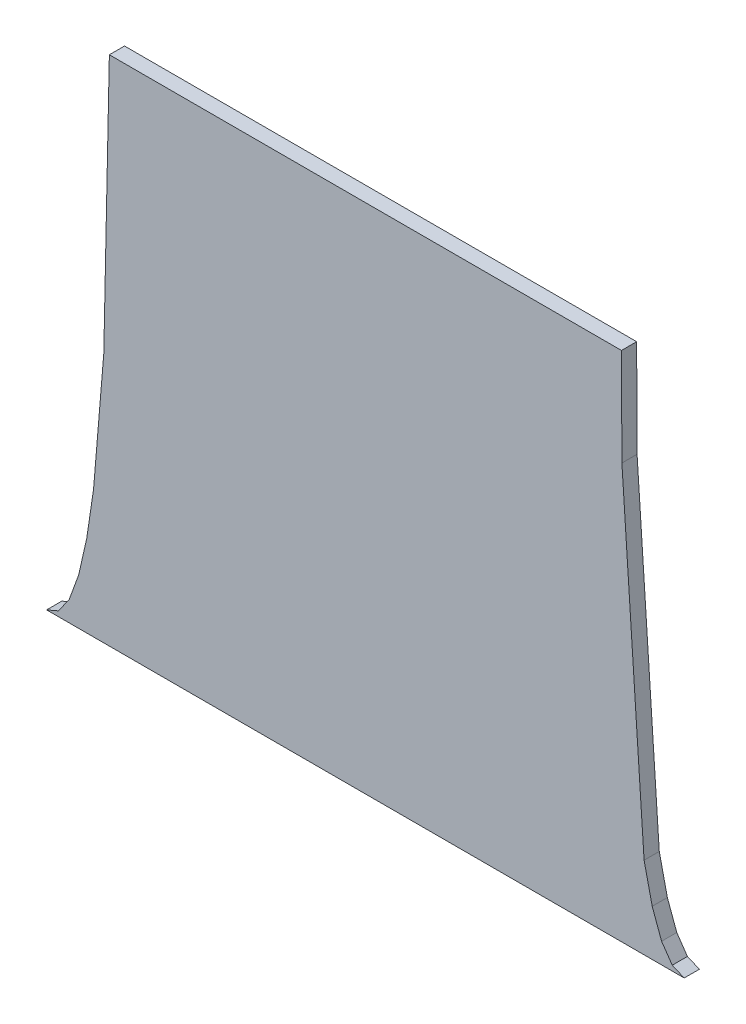
ISO-10303-21;
HEADER;
FILE_DESCRIPTION(('STEP AP214'),'2;1');
FILE_NAME('part.step','',(''),(''),'','','');
FILE_SCHEMA(('AUTOMOTIVE_DESIGN { 1 0 10303 214 1 1 1 1 }'));
ENDSEC;
DATA;
#1=APPLICATION_CONTEXT('core data for automotive mechanical design processes');
#2=APPLICATION_PROTOCOL_DEFINITION('international standard','automotive_design',2000,#1);
#3=PRODUCT_CONTEXT('',#1,'mechanical');
#4=PRODUCT('Part','Part','',(#3));
#5=PRODUCT_RELATED_PRODUCT_CATEGORY('part','',(#4));
#6=PRODUCT_DEFINITION_FORMATION('','',#4);
#7=PRODUCT_DEFINITION_CONTEXT('part definition',#1,'design');
#8=PRODUCT_DEFINITION('design','',#6,#7);
#9=PRODUCT_DEFINITION_SHAPE('','',#8);
#10=(LENGTH_UNIT() NAMED_UNIT(*) SI_UNIT(.MILLI.,.METRE.));
#11=(NAMED_UNIT(*) PLANE_ANGLE_UNIT() SI_UNIT($,.RADIAN.));
#12=(NAMED_UNIT(*) SI_UNIT($,.STERADIAN.) SOLID_ANGLE_UNIT());
#13=UNCERTAINTY_MEASURE_WITH_UNIT(LENGTH_MEASURE(1.E-05),#10,'distance_accuracy_value','');
#14=(GEOMETRIC_REPRESENTATION_CONTEXT(3) GLOBAL_UNCERTAINTY_ASSIGNED_CONTEXT((#13)) GLOBAL_UNIT_ASSIGNED_CONTEXT((#10,
#11,#12)) REPRESENTATION_CONTEXT('',''));
#15=CARTESIAN_POINT('',(0.,0.,0.));
#16=DIRECTION('',(0.,0.,1.));
#17=DIRECTION('',(1.,0.,0.));
#18=AXIS2_PLACEMENT_3D('',#15,#16,#17);
#19=CARTESIAN_POINT('',(105.800003051758,47.9469985961914,0.));
#20=DIRECTION('',(0.999774451350944,-0.0212378536090307,0.));
#21=DIRECTION('',(-0.0212378536090307,-0.999774451350944,0.));
#22=AXIS2_PLACEMENT_3D('',#19,#20,#21);
#23=PLANE('',#22);
#24=DIRECTION('',(-0.0212378536090307,-0.999774451350944,0.));
#25=VECTOR('',#24,1.);
#26=CARTESIAN_POINT('',(105.800003051758,47.9469985961914,0.03556));
#27=LINE('',#26,#25);
#28=CARTESIAN_POINT('',(105.800003051758,47.9469985961914,0.03556));
#29=VERTEX_POINT('',#28);
#30=CARTESIAN_POINT('',(105.787002563477,47.3349990844727,0.03556));
#31=VERTEX_POINT('',#30);
#32=EDGE_CURVE('E11',#29,#31,#27,.T.);
#33=ORIENTED_EDGE('',*,*,#32,.F.);
#34=DIRECTION('',(0.,0.,1.));
#35=VECTOR('',#34,1.);
#36=CARTESIAN_POINT('',(105.800003051758,47.9469985961914,0.));
#37=LINE('',#36,#35);
#38=CARTESIAN_POINT('',(105.800003051758,47.9469985961914,0.));
#39=VERTEX_POINT('',#38);
#40=EDGE_CURVE('E24',#39,#29,#37,.T.);
#41=ORIENTED_EDGE('',*,*,#40,.F.);
#42=DIRECTION('',(-0.0212378536090307,-0.999774451350944,0.));
#43=VECTOR('',#42,1.);
#44=CARTESIAN_POINT('',(105.800003051758,47.9469985961914,0.));
#45=LINE('',#44,#43);
#46=CARTESIAN_POINT('',(105.787002563477,47.3349990844727,0.));
#47=VERTEX_POINT('',#46);
#48=EDGE_CURVE('E142',#39,#47,#45,.T.);
#49=ORIENTED_EDGE('',*,*,#48,.T.);
#50=DIRECTION('',(0.,0.,1.));
#51=VECTOR('',#50,1.);
#52=CARTESIAN_POINT('',(105.787002563477,47.3349990844727,0.));
#53=LINE('',#52,#51);
#54=EDGE_CURVE('E37',#47,#31,#53,.T.);
#55=ORIENTED_EDGE('',*,*,#54,.T.);
#56=EDGE_LOOP('',(#33,#41,#49,#55));
#57=FACE_BOUND('',#56,.T.);
#58=ADVANCED_FACE('F17',(#57),#23,.F.);
#59=CARTESIAN_POINT('',(105.787002563477,47.3349990844727,0.));
#60=DIRECTION('',(0.996545120983932,-0.0830531266306066,0.));
#61=DIRECTION('',(-0.0830531266306066,-0.996545120983932,0.));
#62=AXIS2_PLACEMENT_3D('',#59,#60,#61);
#63=PLANE('',#62);
#64=DIRECTION('',(-0.0830531266306066,-0.996545120983932,0.));
#65=VECTOR('',#64,1.);
#66=CARTESIAN_POINT('',(105.787002563477,47.3349990844727,0.03556));
#67=LINE('',#66,#65);
#68=CARTESIAN_POINT('',(105.763000488281,47.0470008850098,0.03556));
#69=VERTEX_POINT('',#68);
#70=EDGE_CURVE('E238',#31,#69,#67,.T.);
#71=ORIENTED_EDGE('',*,*,#70,.F.);
#72=ORIENTED_EDGE('',*,*,#54,.F.);
#73=DIRECTION('',(-0.0830531266306066,-0.996545120983932,0.));
#74=VECTOR('',#73,1.);
#75=CARTESIAN_POINT('',(105.787002563477,47.3349990844727,0.));
#76=LINE('',#75,#74);
#77=CARTESIAN_POINT('',(105.763000488281,47.0470008850098,0.));
#78=VERTEX_POINT('',#77);
#79=EDGE_CURVE('E235',#47,#78,#76,.T.);
#80=ORIENTED_EDGE('',*,*,#79,.T.);
#81=DIRECTION('',(0.,0.,1.));
#82=VECTOR('',#81,1.);
#83=CARTESIAN_POINT('',(105.763000488281,47.0470008850098,0.));
#84=LINE('',#83,#82);
#85=EDGE_CURVE('E233',#78,#69,#84,.T.);
#86=ORIENTED_EDGE('',*,*,#85,.T.);
#87=EDGE_LOOP('',(#71,#72,#80,#86));
#88=FACE_BOUND('',#87,.T.);
#89=ADVANCED_FACE('F246',(#88),#63,.F.);
#90=CARTESIAN_POINT('',(105.763000488281,47.0470008850098,0.));
#91=DIRECTION('',(0.989205338215747,-0.146535998462731,0.));
#92=DIRECTION('',(-0.146535998462731,-0.989205338215747,0.));
#93=AXIS2_PLACEMENT_3D('',#90,#91,#92);
#94=PLANE('',#93);
#95=DIRECTION('',(-0.146535998462731,-0.989205338215747,0.));
#96=VECTOR('',#95,1.);
#97=CARTESIAN_POINT('',(105.763000488281,47.0470008850098,0.03556));
#98=LINE('',#97,#96);
#99=CARTESIAN_POINT('',(105.747001647949,46.9389991760254,0.03556));
#100=VERTEX_POINT('',#99);
#101=EDGE_CURVE('E230',#69,#100,#98,.T.);
#102=ORIENTED_EDGE('',*,*,#101,.F.);
#103=ORIENTED_EDGE('',*,*,#85,.F.);
#104=DIRECTION('',(-0.146535998462731,-0.989205338215747,0.));
#105=VECTOR('',#104,1.);
#106=CARTESIAN_POINT('',(105.763000488281,47.0470008850098,0.));
#107=LINE('',#106,#105);
#108=CARTESIAN_POINT('',(105.747001647949,46.9389991760254,0.));
#109=VERTEX_POINT('',#108);
#110=EDGE_CURVE('E227',#78,#109,#107,.T.);
#111=ORIENTED_EDGE('',*,*,#110,.T.);
#112=DIRECTION('',(0.,0.,1.));
#113=VECTOR('',#112,1.);
#114=CARTESIAN_POINT('',(105.747001647949,46.9389991760254,0.));
#115=LINE('',#114,#113);
#116=EDGE_CURVE('E225',#109,#100,#115,.T.);
#117=ORIENTED_EDGE('',*,*,#116,.T.);
#118=EDGE_LOOP('',(#102,#103,#111,#117));
#119=FACE_BOUND('',#118,.T.);
#120=ADVANCED_FACE('F252',(#119),#94,.F.);
#121=CARTESIAN_POINT('',(105.747001647949,46.9389991760254,0.));
#122=DIRECTION('',(0.975348205788303,-0.220671424216046,0.));
#123=DIRECTION('',(-0.220671424216046,-0.975348205788303,0.));
#124=AXIS2_PLACEMENT_3D('',#121,#122,#123);
#125=PLANE('',#124);
#126=DIRECTION('',(-0.220671424216046,-0.975348205788303,0.));
#127=VECTOR('',#126,1.);
#128=CARTESIAN_POINT('',(105.747001647949,46.9389991760254,0.03556));
#129=LINE('',#128,#127);
#130=CARTESIAN_POINT('',(105.727996826172,46.8549995422363,0.03556));
#131=VERTEX_POINT('',#130);
#132=EDGE_CURVE('E222',#100,#131,#129,.T.);
#133=ORIENTED_EDGE('',*,*,#132,.F.);
#134=ORIENTED_EDGE('',*,*,#116,.F.);
#135=DIRECTION('',(-0.220671424216046,-0.975348205788303,0.));
#136=VECTOR('',#135,1.);
#137=CARTESIAN_POINT('',(105.747001647949,46.9389991760254,0.));
#138=LINE('',#137,#136);
#139=CARTESIAN_POINT('',(105.727996826172,46.8549995422363,0.));
#140=VERTEX_POINT('',#139);
#141=EDGE_CURVE('E219',#109,#140,#138,.T.);
#142=ORIENTED_EDGE('',*,*,#141,.T.);
#143=DIRECTION('',(0.,0.,1.));
#144=VECTOR('',#143,1.);
#145=CARTESIAN_POINT('',(105.727996826172,46.8549995422363,0.));
#146=LINE('',#145,#144);
#147=EDGE_CURVE('E217',#140,#131,#146,.T.);
#148=ORIENTED_EDGE('',*,*,#147,.T.);
#149=EDGE_LOOP('',(#133,#134,#142,#148));
#150=FACE_BOUND('',#149,.T.);
#151=ADVANCED_FACE('F254',(#150),#125,.F.);
#152=CARTESIAN_POINT('',(105.727996826172,46.8549995422363,0.));
#153=DIRECTION('',(0.93890139471666,-0.3441862446396,0.));
#154=DIRECTION('',(-0.3441862446396,-0.93890139471666,0.));
#155=AXIS2_PLACEMENT_3D('',#152,#153,#154);
#156=PLANE('',#155);
#157=DIRECTION('',(-0.3441862446396,-0.93890139471666,0.));
#158=VECTOR('',#157,1.);
#159=CARTESIAN_POINT('',(105.727996826172,46.8549995422363,0.03556));
#160=LINE('',#159,#158);
#161=CARTESIAN_POINT('',(105.706001281738,46.7949981689453,0.03556));
#162=VERTEX_POINT('',#161);
#163=EDGE_CURVE('E214',#131,#162,#160,.T.);
#164=ORIENTED_EDGE('',*,*,#163,.F.);
#165=ORIENTED_EDGE('',*,*,#147,.F.);
#166=DIRECTION('',(-0.3441862446396,-0.93890139471666,0.));
#167=VECTOR('',#166,1.);
#168=CARTESIAN_POINT('',(105.727996826172,46.8549995422363,0.));
#169=LINE('',#168,#167);
#170=CARTESIAN_POINT('',(105.706001281738,46.7949981689453,0.));
#171=VERTEX_POINT('',#170);
#172=EDGE_CURVE('E211',#140,#171,#169,.T.);
#173=ORIENTED_EDGE('',*,*,#172,.T.);
#174=DIRECTION('',(0.,0.,1.));
#175=VECTOR('',#174,1.);
#176=CARTESIAN_POINT('',(105.706001281738,46.7949981689453,0.));
#177=LINE('',#176,#175);
#178=EDGE_CURVE('E209',#171,#162,#177,.T.);
#179=ORIENTED_EDGE('',*,*,#178,.T.);
#180=EDGE_LOOP('',(#164,#165,#173,#179));
#181=FACE_BOUND('',#180,.T.);
#182=ADVANCED_FACE('F259',(#181),#156,.F.);
#183=CARTESIAN_POINT('',(105.706001281738,46.7949981689453,0.));
#184=DIRECTION('',(0.821348444223406,-0.57042679913534,0.));
#185=DIRECTION('',(-0.57042679913534,-0.821348444223406,0.));
#186=AXIS2_PLACEMENT_3D('',#183,#184,#185);
#187=PLANE('',#186);
#188=DIRECTION('',(-0.57042679913534,-0.821348444223406,0.));
#189=VECTOR('',#188,1.);
#190=CARTESIAN_POINT('',(105.706001281738,46.7949981689453,0.03556));
#191=LINE('',#190,#189);
#192=CARTESIAN_POINT('',(105.680999755859,46.7589988708496,0.03556));
#193=VERTEX_POINT('',#192);
#194=EDGE_CURVE('E206',#162,#193,#191,.T.);
#195=ORIENTED_EDGE('',*,*,#194,.F.);
#196=ORIENTED_EDGE('',*,*,#178,.F.);
#197=DIRECTION('',(-0.57042679913534,-0.821348444223406,0.));
#198=VECTOR('',#197,1.);
#199=CARTESIAN_POINT('',(105.706001281738,46.7949981689453,0.));
#200=LINE('',#199,#198);
#201=CARTESIAN_POINT('',(105.680999755859,46.7589988708496,0.));
#202=VERTEX_POINT('',#201);
#203=EDGE_CURVE('E203',#171,#202,#200,.T.);
#204=ORIENTED_EDGE('',*,*,#203,.T.);
#205=DIRECTION('',(0.,0.,1.));
#206=VECTOR('',#205,1.);
#207=CARTESIAN_POINT('',(105.680999755859,46.7589988708496,0.));
#208=LINE('',#207,#206);
#209=EDGE_CURVE('E201',#202,#193,#208,.T.);
#210=ORIENTED_EDGE('',*,*,#209,.T.);
#211=EDGE_LOOP('',(#195,#196,#204,#210));
#212=FACE_BOUND('',#211,.T.);
#213=ADVANCED_FACE('F262',(#212),#187,.F.);
#214=CARTESIAN_POINT('',(105.680999755859,46.7589988708496,0.));
#215=DIRECTION('',(0.39384372830701,-0.919177413600462,0.));
#216=DIRECTION('',(-0.919177413600462,-0.39384372830701,0.));
#217=AXIS2_PLACEMENT_3D('',#214,#215,#216);
#218=PLANE('',#217);
#219=DIRECTION('',(-0.919177413600462,-0.39384372830701,0.));
#220=VECTOR('',#219,1.);
#221=CARTESIAN_POINT('',(105.680999755859,46.7589988708496,0.03556));
#222=LINE('',#221,#220);
#223=CARTESIAN_POINT('',(105.65299987793,46.7470016479492,0.03556));
#224=VERTEX_POINT('',#223);
#225=EDGE_CURVE('E198',#193,#224,#222,.T.);
#226=ORIENTED_EDGE('',*,*,#225,.F.);
#227=ORIENTED_EDGE('',*,*,#209,.F.);
#228=DIRECTION('',(-0.919177413600462,-0.39384372830701,0.));
#229=VECTOR('',#228,1.);
#230=CARTESIAN_POINT('',(105.680999755859,46.7589988708496,0.));
#231=LINE('',#230,#229);
#232=CARTESIAN_POINT('',(105.65299987793,46.7470016479492,0.));
#233=VERTEX_POINT('',#232);
#234=EDGE_CURVE('E195',#202,#233,#231,.T.);
#235=ORIENTED_EDGE('',*,*,#234,.T.);
#236=DIRECTION('',(0.,0.,1.));
#237=VECTOR('',#236,1.);
#238=CARTESIAN_POINT('',(105.65299987793,46.7470016479492,0.));
#239=LINE('',#238,#237);
#240=EDGE_CURVE('E193',#233,#224,#239,.T.);
#241=ORIENTED_EDGE('',*,*,#240,.T.);
#242=EDGE_LOOP('',(#226,#227,#235,#241));
#243=FACE_BOUND('',#242,.T.);
#244=ADVANCED_FACE('F267',(#243),#218,.F.);
#245=CARTESIAN_POINT('',(105.65299987793,46.7470016479492,0.));
#246=DIRECTION('',(0.,1.,0.));
#247=DIRECTION('',(1.,0.,0.));
#248=AXIS2_PLACEMENT_3D('',#245,#246,#247);
#249=PLANE('',#248);
#250=DIRECTION('',(1.,0.,0.));
#251=VECTOR('',#250,1.);
#252=CARTESIAN_POINT('',(105.65299987793,46.7470016479492,0.03556));
#253=LINE('',#252,#251);
#254=CARTESIAN_POINT('',(107.147003173828,46.7470016479492,0.03556));
#255=VERTEX_POINT('',#254);
#256=EDGE_CURVE('E190',#224,#255,#253,.T.);
#257=ORIENTED_EDGE('',*,*,#256,.F.);
#258=ORIENTED_EDGE('',*,*,#240,.F.);
#259=DIRECTION('',(1.,0.,0.));
#260=VECTOR('',#259,1.);
#261=CARTESIAN_POINT('',(105.65299987793,46.7470016479492,0.));
#262=LINE('',#261,#260);
#263=CARTESIAN_POINT('',(107.147003173828,46.7470016479492,0.));
#264=VERTEX_POINT('',#263);
#265=EDGE_CURVE('E187',#233,#264,#262,.T.);
#266=ORIENTED_EDGE('',*,*,#265,.T.);
#267=DIRECTION('',(0.,0.,1.));
#268=VECTOR('',#267,1.);
#269=CARTESIAN_POINT('',(107.147003173828,46.7470016479492,0.));
#270=LINE('',#269,#268);
#271=EDGE_CURVE('E185',#264,#255,#270,.T.);
#272=ORIENTED_EDGE('',*,*,#271,.T.);
#273=EDGE_LOOP('',(#257,#258,#266,#272));
#274=FACE_BOUND('',#273,.T.);
#275=ADVANCED_FACE('F270',(#274),#249,.F.);
#276=CARTESIAN_POINT('',(107.147003173828,46.7470016479492,0.));
#277=DIRECTION('',(-0.39384372830701,-0.919177413600462,0.));
#278=DIRECTION('',(-0.919177413600462,0.39384372830701,0.));
#279=AXIS2_PLACEMENT_3D('',#276,#277,#278);
#280=PLANE('',#279);
#281=DIRECTION('',(-0.919177413600462,0.39384372830701,0.));
#282=VECTOR('',#281,1.);
#283=CARTESIAN_POINT('',(107.147003173828,46.7470016479492,0.03556));
#284=LINE('',#283,#282);
#285=CARTESIAN_POINT('',(107.119003295898,46.7589988708496,0.03556));
#286=VERTEX_POINT('',#285);
#287=EDGE_CURVE('E182',#255,#286,#284,.T.);
#288=ORIENTED_EDGE('',*,*,#287,.F.);
#289=ORIENTED_EDGE('',*,*,#271,.F.);
#290=DIRECTION('',(-0.919177413600462,0.39384372830701,0.));
#291=VECTOR('',#290,1.);
#292=CARTESIAN_POINT('',(107.147003173828,46.7470016479492,0.));
#293=LINE('',#292,#291);
#294=CARTESIAN_POINT('',(107.119003295898,46.7589988708496,0.));
#295=VERTEX_POINT('',#294);
#296=EDGE_CURVE('E179',#264,#295,#293,.T.);
#297=ORIENTED_EDGE('',*,*,#296,.T.);
#298=DIRECTION('',(0.,0.,1.));
#299=VECTOR('',#298,1.);
#300=CARTESIAN_POINT('',(107.119003295898,46.7589988708496,0.));
#301=LINE('',#300,#299);
#302=EDGE_CURVE('E177',#295,#286,#301,.T.);
#303=ORIENTED_EDGE('',*,*,#302,.T.);
#304=EDGE_LOOP('',(#288,#289,#297,#303));
#305=FACE_BOUND('',#304,.T.);
#306=ADVANCED_FACE('F275',(#305),#280,.F.);
#307=CARTESIAN_POINT('',(107.119003295898,46.7589988708496,0.));
#308=DIRECTION('',(-0.821348444223406,-0.57042679913534,0.));
#309=DIRECTION('',(-0.57042679913534,0.821348444223406,0.));
#310=AXIS2_PLACEMENT_3D('',#307,#308,#309);
#311=PLANE('',#310);
#312=DIRECTION('',(-0.57042679913534,0.821348444223406,0.));
#313=VECTOR('',#312,1.);
#314=CARTESIAN_POINT('',(107.119003295898,46.7589988708496,0.03556));
#315=LINE('',#314,#313);
#316=CARTESIAN_POINT('',(107.09400177002,46.7949981689453,0.03556));
#317=VERTEX_POINT('',#316);
#318=EDGE_CURVE('E174',#286,#317,#315,.T.);
#319=ORIENTED_EDGE('',*,*,#318,.F.);
#320=ORIENTED_EDGE('',*,*,#302,.F.);
#321=DIRECTION('',(-0.57042679913534,0.821348444223406,0.));
#322=VECTOR('',#321,1.);
#323=CARTESIAN_POINT('',(107.119003295898,46.7589988708496,0.));
#324=LINE('',#323,#322);
#325=CARTESIAN_POINT('',(107.09400177002,46.7949981689453,0.));
#326=VERTEX_POINT('',#325);
#327=EDGE_CURVE('E171',#295,#326,#324,.T.);
#328=ORIENTED_EDGE('',*,*,#327,.T.);
#329=DIRECTION('',(0.,0.,1.));
#330=VECTOR('',#329,1.);
#331=CARTESIAN_POINT('',(107.09400177002,46.7949981689453,0.));
#332=LINE('',#331,#330);
#333=EDGE_CURVE('E169',#326,#317,#332,.T.);
#334=ORIENTED_EDGE('',*,*,#333,.T.);
#335=EDGE_LOOP('',(#319,#320,#328,#334));
#336=FACE_BOUND('',#335,.T.);
#337=ADVANCED_FACE('F278',(#336),#311,.F.);
#338=CARTESIAN_POINT('',(107.09400177002,46.7949981689453,0.));
#339=DIRECTION('',(-0.938862810392016,-0.344291480090352,0.));
#340=DIRECTION('',(-0.344291480090352,0.938862810392016,0.));
#341=AXIS2_PLACEMENT_3D('',#338,#339,#340);
#342=PLANE('',#341);
#343=DIRECTION('',(-0.344291480090352,0.938862810392016,0.));
#344=VECTOR('',#343,1.);
#345=CARTESIAN_POINT('',(107.09400177002,46.7949981689453,0.03556));
#346=LINE('',#345,#344);
#347=CARTESIAN_POINT('',(107.071998596191,46.8549995422363,0.03556));
#348=VERTEX_POINT('',#347);
#349=EDGE_CURVE('E166',#317,#348,#346,.T.);
#350=ORIENTED_EDGE('',*,*,#349,.F.);
#351=ORIENTED_EDGE('',*,*,#333,.F.);
#352=DIRECTION('',(-0.344291480090352,0.938862810392016,0.));
#353=VECTOR('',#352,1.);
#354=CARTESIAN_POINT('',(107.09400177002,46.7949981689453,0.));
#355=LINE('',#354,#353);
#356=CARTESIAN_POINT('',(107.071998596191,46.8549995422363,0.));
#357=VERTEX_POINT('',#356);
#358=EDGE_CURVE('E163',#326,#357,#355,.T.);
#359=ORIENTED_EDGE('',*,*,#358,.T.);
#360=DIRECTION('',(0.,0.,1.));
#361=VECTOR('',#360,1.);
#362=CARTESIAN_POINT('',(107.071998596191,46.8549995422363,0.));
#363=LINE('',#362,#361);
#364=EDGE_CURVE('E161',#357,#348,#363,.T.);
#365=ORIENTED_EDGE('',*,*,#364,.T.);
#366=EDGE_LOOP('',(#350,#351,#359,#365));
#367=FACE_BOUND('',#366,.T.);
#368=ADVANCED_FACE('F283',(#367),#342,.F.);
#369=CARTESIAN_POINT('',(107.071998596191,46.8549995422363,0.));
#370=DIRECTION('',(-0.975367269335275,-0.220587148105798,0.));
#371=DIRECTION('',(-0.220587148105798,0.975367269335275,0.));
#372=AXIS2_PLACEMENT_3D('',#369,#370,#371);
#373=PLANE('',#372);
#374=DIRECTION('',(-0.220587148105798,0.975367269335275,0.));
#375=VECTOR('',#374,1.);
#376=CARTESIAN_POINT('',(107.071998596191,46.8549995422363,0.03556));
#377=LINE('',#376,#375);
#378=CARTESIAN_POINT('',(107.053001403809,46.9389991760254,0.03556));
#379=VERTEX_POINT('',#378);
#380=EDGE_CURVE('E158',#348,#379,#377,.T.);
#381=ORIENTED_EDGE('',*,*,#380,.F.);
#382=ORIENTED_EDGE('',*,*,#364,.F.);
#383=DIRECTION('',(-0.220587148105798,0.975367269335275,0.));
#384=VECTOR('',#383,1.);
#385=CARTESIAN_POINT('',(107.071998596191,46.8549995422363,0.));
#386=LINE('',#385,#384);
#387=CARTESIAN_POINT('',(107.053001403809,46.9389991760254,0.));
#388=VERTEX_POINT('',#387);
#389=EDGE_CURVE('E155',#357,#388,#386,.T.);
#390=ORIENTED_EDGE('',*,*,#389,.T.);
#391=DIRECTION('',(0.,0.,1.));
#392=VECTOR('',#391,1.);
#393=CARTESIAN_POINT('',(107.053001403809,46.9389991760254,0.));
#394=LINE('',#393,#392);
#395=EDGE_CURVE('E153',#388,#379,#394,.T.);
#396=ORIENTED_EDGE('',*,*,#395,.T.);
#397=EDGE_LOOP('',(#381,#382,#390,#396));
#398=FACE_BOUND('',#397,.T.);
#399=ADVANCED_FACE('F286',(#398),#373,.F.);
#400=CARTESIAN_POINT('',(107.053001403809,46.9389991760254,0.));
#401=DIRECTION('',(-0.99778500671014,-0.0665212776820051,0.));
#402=DIRECTION('',(-0.0665212776820051,0.99778500671014,0.));
#403=AXIS2_PLACEMENT_3D('',#400,#401,#402);
#404=PLANE('',#403);
#405=DIRECTION('',(-0.0665212776820051,0.99778500671014,0.));
#406=VECTOR('',#405,1.);
#407=CARTESIAN_POINT('',(107.053001403809,46.9389991760254,0.03556));
#408=LINE('',#407,#406);
#409=CARTESIAN_POINT('',(107.000999450684,47.7190017700195,0.03556));
#410=VERTEX_POINT('',#409);
#411=EDGE_CURVE('E150',#379,#410,#408,.T.);
#412=ORIENTED_EDGE('',*,*,#411,.F.);
#413=ORIENTED_EDGE('',*,*,#395,.F.);
#414=DIRECTION('',(-0.0665212776820051,0.99778500671014,0.));
#415=VECTOR('',#414,1.);
#416=CARTESIAN_POINT('',(107.053001403809,46.9389991760254,0.));
#417=LINE('',#416,#415);
#418=CARTESIAN_POINT('',(107.000999450684,47.7190017700195,0.));
#419=VERTEX_POINT('',#418);
#420=EDGE_CURVE('E148',#388,#419,#417,.T.);
#421=ORIENTED_EDGE('',*,*,#420,.T.);
#422=DIRECTION('',(0.,0.,1.));
#423=VECTOR('',#422,1.);
#424=CARTESIAN_POINT('',(107.000999450684,47.7190017700195,0.));
#425=LINE('',#424,#423);
#426=EDGE_CURVE('E133',#419,#410,#425,.T.);
#427=ORIENTED_EDGE('',*,*,#426,.T.);
#428=EDGE_LOOP('',(#412,#413,#421,#427));
#429=FACE_BOUND('',#428,.T.);
#430=ADVANCED_FACE('F289',(#429),#404,.F.);
#431=CARTESIAN_POINT('',(107.000999450684,47.7190017700195,0.));
#432=DIRECTION('',(-0.999990392090998,-0.00438357453366085,0.));
#433=DIRECTION('',(-0.00438357453366085,0.999990392090998,0.));
#434=AXIS2_PLACEMENT_3D('',#431,#432,#433);
#435=PLANE('',#434);
#436=DIRECTION('',(-0.00438357453366085,0.999990392090998,0.));
#437=VECTOR('',#436,1.);
#438=CARTESIAN_POINT('',(107.000999450684,47.7190017700195,0.03556));
#439=LINE('',#438,#437);
#440=CARTESIAN_POINT('',(107.,47.9469985961914,0.03556));
#441=VERTEX_POINT('',#440);
#442=EDGE_CURVE('E137',#410,#441,#439,.T.);
#443=ORIENTED_EDGE('',*,*,#442,.F.);
#444=ORIENTED_EDGE('',*,*,#426,.F.);
#445=DIRECTION('',(-0.00438357453366085,0.999990392090998,0.));
#446=VECTOR('',#445,1.);
#447=CARTESIAN_POINT('',(107.000999450684,47.7190017700195,0.));
#448=LINE('',#447,#446);
#449=CARTESIAN_POINT('',(107.,47.9469985961914,0.));
#450=VERTEX_POINT('',#449);
#451=EDGE_CURVE('E129',#419,#450,#448,.T.);
#452=ORIENTED_EDGE('',*,*,#451,.T.);
#453=DIRECTION('',(0.,0.,1.));
#454=VECTOR('',#453,1.);
#455=CARTESIAN_POINT('',(107.,47.9469985961914,0.));
#456=LINE('',#455,#454);
#457=EDGE_CURVE('E119',#450,#441,#456,.T.);
#458=ORIENTED_EDGE('',*,*,#457,.T.);
#459=EDGE_LOOP('',(#443,#444,#452,#458));
#460=FACE_BOUND('',#459,.T.);
#461=ADVANCED_FACE('F132',(#460),#435,.F.);
#462=CARTESIAN_POINT('',(107.,47.9469985961914,0.));
#463=DIRECTION('',(0.,-1.,0.));
#464=DIRECTION('',(-1.,0.,0.));
#465=AXIS2_PLACEMENT_3D('',#462,#463,#464);
#466=PLANE('',#465);
#467=DIRECTION('',(-1.,0.,0.));
#468=VECTOR('',#467,1.);
#469=CARTESIAN_POINT('',(107.,47.9469985961914,0.03556));
#470=LINE('',#469,#468);
#471=EDGE_CURVE('E125',#441,#29,#470,.T.);
#472=ORIENTED_EDGE('',*,*,#471,.F.);
#473=ORIENTED_EDGE('',*,*,#457,.F.);
#474=DIRECTION('',(-1.,0.,0.));
#475=VECTOR('',#474,1.);
#476=CARTESIAN_POINT('',(107.,47.9469985961914,0.));
#477=LINE('',#476,#475);
#478=EDGE_CURVE('E123',#450,#39,#477,.T.);
#479=ORIENTED_EDGE('',*,*,#478,.T.);
#480=ORIENTED_EDGE('',*,*,#40,.T.);
#481=EDGE_LOOP('',(#472,#473,#479,#480));
#482=FACE_BOUND('',#481,.T.);
#483=ADVANCED_FACE('F121',(#482),#466,.F.);
#484=CARTESIAN_POINT('',(105.800003051758,47.9469985961914,0.));
#485=DIRECTION('',(0.,0.,1.));
#486=DIRECTION('',(1.,0.,0.));
#487=AXIS2_PLACEMENT_3D('',#484,#485,#486);
#488=PLANE('',#487);
#489=ORIENTED_EDGE('',*,*,#478,.F.);
#490=ORIENTED_EDGE('',*,*,#451,.F.);
#491=ORIENTED_EDGE('',*,*,#420,.F.);
#492=ORIENTED_EDGE('',*,*,#389,.F.);
#493=ORIENTED_EDGE('',*,*,#358,.F.);
#494=ORIENTED_EDGE('',*,*,#327,.F.);
#495=ORIENTED_EDGE('',*,*,#296,.F.);
#496=ORIENTED_EDGE('',*,*,#265,.F.);
#497=ORIENTED_EDGE('',*,*,#234,.F.);
#498=ORIENTED_EDGE('',*,*,#203,.F.);
#499=ORIENTED_EDGE('',*,*,#172,.F.);
#500=ORIENTED_EDGE('',*,*,#141,.F.);
#501=ORIENTED_EDGE('',*,*,#110,.F.);
#502=ORIENTED_EDGE('',*,*,#79,.F.);
#503=ORIENTED_EDGE('',*,*,#48,.F.);
#504=EDGE_LOOP('',(#489,#490,#491,#492,#493,#494,#495,#496,#497,#498,#499,#500,#501,#502,#503));
#505=FACE_BOUND('',#504,.T.);
#506=ADVANCED_FACE('F140',(#505),#488,.F.);
#507=CARTESIAN_POINT('',(105.800003051758,47.9469985961914,0.03556));
#508=DIRECTION('',(0.,0.,1.));
#509=DIRECTION('',(1.,0.,0.));
#510=AXIS2_PLACEMENT_3D('',#507,#508,#509);
#511=PLANE('',#510);
#512=ORIENTED_EDGE('',*,*,#32,.T.);
#513=ORIENTED_EDGE('',*,*,#70,.T.);
#514=ORIENTED_EDGE('',*,*,#101,.T.);
#515=ORIENTED_EDGE('',*,*,#132,.T.);
#516=ORIENTED_EDGE('',*,*,#163,.T.);
#517=ORIENTED_EDGE('',*,*,#194,.T.);
#518=ORIENTED_EDGE('',*,*,#225,.T.);
#519=ORIENTED_EDGE('',*,*,#256,.T.);
#520=ORIENTED_EDGE('',*,*,#287,.T.);
#521=ORIENTED_EDGE('',*,*,#318,.T.);
#522=ORIENTED_EDGE('',*,*,#349,.T.);
#523=ORIENTED_EDGE('',*,*,#380,.T.);
#524=ORIENTED_EDGE('',*,*,#411,.T.);
#525=ORIENTED_EDGE('',*,*,#442,.T.);
#526=ORIENTED_EDGE('',*,*,#471,.T.);
#527=EDGE_LOOP('',(#512,#513,#514,#515,#516,#517,#518,#519,#520,#521,#522,#523,#524,#525,#526));
#528=FACE_BOUND('',#527,.T.);
#529=ADVANCED_FACE('F249',(#528),#511,.T.);
#530=CLOSED_SHELL('',(#58,#89,#120,#151,#182,#213,#244,#275,#306,#337,#368,#399,#430,#461,#483,
#506,#529));
#531=MANIFOLD_SOLID_BREP('B1',#530);
#532=ADVANCED_BREP_SHAPE_REPRESENTATION('',(#18,#531),#14);
#533=SHAPE_DEFINITION_REPRESENTATION(#9,#532);
ENDSEC;
END-ISO-10303-21;
